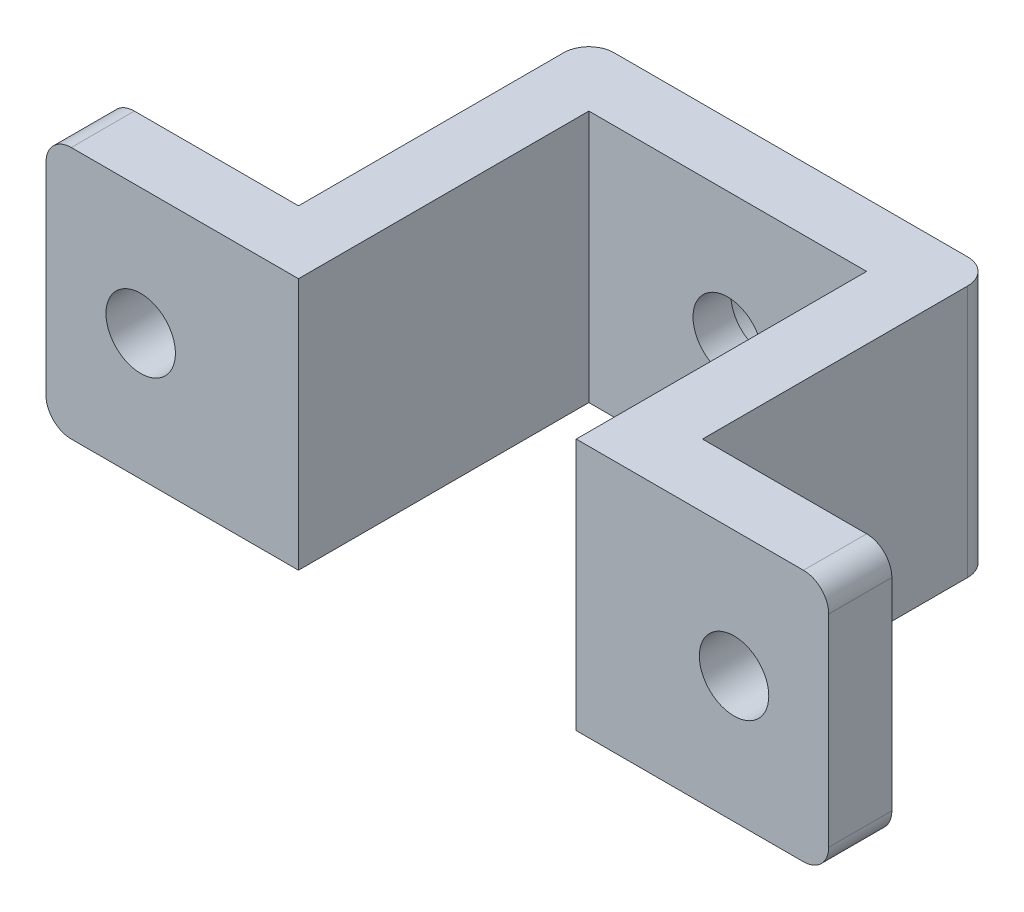
ISO-10303-21;
HEADER;
FILE_DESCRIPTION(('STEP AP214'),'2;1');
FILE_NAME('part.step','',(''),(''),'','','');
FILE_SCHEMA(('AUTOMOTIVE_DESIGN { 1 0 10303 214 1 1 1 1 }'));
ENDSEC;
DATA;
#1=APPLICATION_CONTEXT('core data for automotive mechanical design processes');
#2=APPLICATION_PROTOCOL_DEFINITION('international standard','automotive_design',2000,#1);
#3=PRODUCT_CONTEXT('',#1,'mechanical');
#4=PRODUCT('Part','Part','',(#3));
#5=PRODUCT_RELATED_PRODUCT_CATEGORY('part','',(#4));
#6=PRODUCT_DEFINITION_FORMATION('','',#4);
#7=PRODUCT_DEFINITION_CONTEXT('part definition',#1,'design');
#8=PRODUCT_DEFINITION('design','',#6,#7);
#9=PRODUCT_DEFINITION_SHAPE('','',#8);
#10=(LENGTH_UNIT() NAMED_UNIT(*) SI_UNIT(.MILLI.,.METRE.));
#11=(NAMED_UNIT(*) PLANE_ANGLE_UNIT() SI_UNIT($,.RADIAN.));
#12=(NAMED_UNIT(*) SI_UNIT($,.STERADIAN.) SOLID_ANGLE_UNIT());
#13=UNCERTAINTY_MEASURE_WITH_UNIT(LENGTH_MEASURE(1.E-05),#10,'distance_accuracy_value','');
#14=(GEOMETRIC_REPRESENTATION_CONTEXT(3) GLOBAL_UNCERTAINTY_ASSIGNED_CONTEXT((#13)) GLOBAL_UNIT_ASSIGNED_CONTEXT((#10,
#11,#12)) REPRESENTATION_CONTEXT('',''));
#15=CARTESIAN_POINT('',(0.,0.,0.));
#16=DIRECTION('',(0.,0.,1.));
#17=DIRECTION('',(1.,0.,0.));
#18=AXIS2_PLACEMENT_3D('',#15,#16,#17);
#19=CARTESIAN_POINT('',(3.94202898550725,10.,21.7777777777778));
#20=DIRECTION('',(0.,0.,-1.));
#21=DIRECTION('',(-1.,0.,0.));
#22=AXIS2_PLACEMENT_3D('',#19,#20,#21);
#23=CYLINDRICAL_SURFACE('',#22,2.75);
#24=CARTESIAN_POINT('',(3.94202898550725,10.,-1.22222222222222));
#25=DIRECTION('',(0.,0.,-1.));
#26=DIRECTION('',(-1.,0.,0.));
#27=AXIS2_PLACEMENT_3D('',#24,#25,#26);
#28=CIRCLE('',#27,2.75);
#29=CARTESIAN_POINT('',(1.19202898550725,10.,-1.22222222222222));
#30=VERTEX_POINT('',#29);
#31=EDGE_CURVE('E229',#30,#30,#28,.T.);
#32=ORIENTED_EDGE('',*,*,#31,.F.);
#33=EDGE_LOOP('',(#32));
#34=FACE_BOUND('',#33,.T.);
#35=CARTESIAN_POINT('',(3.94202898550725,10.,-4.22222222222222));
#36=DIRECTION('',(0.,0.,-1.));
#37=DIRECTION('',(-1.,0.,0.));
#38=AXIS2_PLACEMENT_3D('',#35,#36,#37);
#39=CIRCLE('',#38,2.75);
#40=CARTESIAN_POINT('',(1.19202898550725,10.,-4.22222222222222));
#41=VERTEX_POINT('',#40);
#42=EDGE_CURVE('E63',#41,#41,#39,.F.);
#43=ORIENTED_EDGE('',*,*,#42,.F.);
#44=EDGE_LOOP('',(#43));
#45=FACE_BOUND('',#44,.T.);
#46=ADVANCED_FACE('F59',(#34,#45),#23,.F.);
#47=CARTESIAN_POINT('',(-12.0579710144928,20.,-6.22222222222222));
#48=DIRECTION('',(1.,0.,0.));
#49=DIRECTION('',(0.,0.,-1.));
#50=AXIS2_PLACEMENT_3D('',#47,#48,#49);
#51=PLANE('',#50);
#52=DIRECTION('',(0.,0.,1.));
#53=VECTOR('',#52,1.);
#54=CARTESIAN_POINT('',(-12.0579710144928,20.,-6.22222222222222));
#55=LINE('',#54,#53);
#56=CARTESIAN_POINT('',(-12.0579710144928,20.,-4.22222222222222));
#57=VERTEX_POINT('',#56);
#58=CARTESIAN_POINT('',(-12.0579710144928,20.,16.7777777777778));
#59=VERTEX_POINT('',#58);
#60=EDGE_CURVE('E246',#57,#59,#55,.T.);
#61=ORIENTED_EDGE('',*,*,#60,.F.);
#62=DIRECTION('',(0.,-1.,0.));
#63=VECTOR('',#62,1.);
#64=CARTESIAN_POINT('',(-12.0579710144928,20.,-4.22222222222222));
#65=LINE('',#64,#63);
#66=CARTESIAN_POINT('',(-12.0579710144928,0.,-4.22222222222222));
#67=VERTEX_POINT('',#66);
#68=EDGE_CURVE('E12',#57,#67,#65,.T.);
#69=ORIENTED_EDGE('',*,*,#68,.T.);
#70=DIRECTION('',(0.,0.,1.));
#71=VECTOR('',#70,1.);
#72=CARTESIAN_POINT('',(-12.0579710144928,0.,-6.22222222222222));
#73=LINE('',#72,#71);
#74=CARTESIAN_POINT('',(-12.0579710144928,0.,16.7777777777778));
#75=VERTEX_POINT('',#74);
#76=EDGE_CURVE('E225',#67,#75,#73,.T.);
#77=ORIENTED_EDGE('',*,*,#76,.T.);
#78=DIRECTION('',(0.,-1.,0.));
#79=VECTOR('',#78,1.);
#80=CARTESIAN_POINT('',(-12.0579710144928,0.,16.7777777777778));
#81=LINE('',#80,#79);
#82=EDGE_CURVE('E325',#59,#75,#81,.T.);
#83=ORIENTED_EDGE('',*,*,#82,.F.);
#84=EDGE_LOOP('',(#61,#69,#77,#83));
#85=FACE_BOUND('',#84,.T.);
#86=ADVANCED_FACE('F389',(#85),#51,.F.);
#87=CARTESIAN_POINT('',(-12.0579710144928,20.,21.7777777777778));
#88=DIRECTION('',(0.,0.,-1.));
#89=DIRECTION('',(-1.,0.,0.));
#90=AXIS2_PLACEMENT_3D('',#87,#88,#89);
#91=PLANE('',#90);
#92=CARTESIAN_POINT('',(-19.5579710144928,10.,21.7777777777778));
#93=DIRECTION('',(0.,0.,-1.));
#94=DIRECTION('',(-1.,0.,0.));
#95=AXIS2_PLACEMENT_3D('',#92,#93,#94);
#96=CIRCLE('',#95,2.75);
#97=CARTESIAN_POINT('',(-22.3079710144928,10.,21.7777777777778));
#98=VERTEX_POINT('',#97);
#99=EDGE_CURVE('E328',#98,#98,#96,.T.);
#100=ORIENTED_EDGE('',*,*,#99,.T.);
#101=EDGE_LOOP('',(#100));
#102=FACE_BOUND('',#101,.T.);
#103=DIRECTION('',(0.,1.,0.));
#104=VECTOR('',#103,1.);
#105=CARTESIAN_POINT('',(-27.0579710144928,20.,21.7777777777778));
#106=LINE('',#105,#104);
#107=CARTESIAN_POINT('',(-27.0579710144928,2.,21.7777777777778));
#108=VERTEX_POINT('',#107);
#109=CARTESIAN_POINT('',(-27.0579710144928,18.,21.7777777777778));
#110=VERTEX_POINT('',#109);
#111=EDGE_CURVE('E319',#108,#110,#106,.T.);
#112=ORIENTED_EDGE('',*,*,#111,.F.);
#113=CARTESIAN_POINT('',(-25.0579710144928,2.,21.7777777777778));
#114=DIRECTION('',(0.,0.,-1.));
#115=DIRECTION('',(-1.,0.,0.));
#116=AXIS2_PLACEMENT_3D('',#113,#114,#115);
#117=CIRCLE('',#116,2.);
#118=CARTESIAN_POINT('',(-25.0579710144928,0.,21.7777777777778));
#119=VERTEX_POINT('',#118);
#120=EDGE_CURVE('E299',#108,#119,#117,.F.);
#121=ORIENTED_EDGE('',*,*,#120,.T.);
#122=DIRECTION('',(1.,0.,0.));
#123=VECTOR('',#122,1.);
#124=CARTESIAN_POINT('',(-12.0579710144928,0.,21.7777777777778));
#125=LINE('',#124,#123);
#126=CARTESIAN_POINT('',(-7.05797101449275,0.,21.7777777777778));
#127=VERTEX_POINT('',#126);
#128=EDGE_CURVE('E228',#119,#127,#125,.T.);
#129=ORIENTED_EDGE('',*,*,#128,.T.);
#130=DIRECTION('',(0.,-1.,0.));
#131=VECTOR('',#130,1.);
#132=CARTESIAN_POINT('',(-7.05797101449275,20.,21.7777777777778));
#133=LINE('',#132,#131);
#134=CARTESIAN_POINT('',(-7.05797101449275,20.,21.7777777777778));
#135=VERTEX_POINT('',#134);
#136=EDGE_CURVE('E255',#135,#127,#133,.T.);
#137=ORIENTED_EDGE('',*,*,#136,.F.);
#138=DIRECTION('',(1.,0.,0.));
#139=VECTOR('',#138,1.);
#140=CARTESIAN_POINT('',(-12.0579710144928,20.,21.7777777777778));
#141=LINE('',#140,#139);
#142=CARTESIAN_POINT('',(-25.0579710144928,20.,21.7777777777778));
#143=VERTEX_POINT('',#142);
#144=EDGE_CURVE('E321',#143,#135,#141,.T.);
#145=ORIENTED_EDGE('',*,*,#144,.F.);
#146=CARTESIAN_POINT('',(-25.0579710144928,18.,21.7777777777778));
#147=DIRECTION('',(0.,0.,-1.));
#148=DIRECTION('',(-1.,0.,0.));
#149=AXIS2_PLACEMENT_3D('',#146,#147,#148);
#150=CIRCLE('',#149,2.);
#151=EDGE_CURVE('E297',#143,#110,#150,.F.);
#152=ORIENTED_EDGE('',*,*,#151,.T.);
#153=EDGE_LOOP('',(#112,#121,#129,#137,#145,#152));
#154=FACE_BOUND('',#153,.T.);
#155=ADVANCED_FACE('F318',(#102,#154),#91,.F.);
#156=CARTESIAN_POINT('',(-7.05797101449275,20.,-1.22222222222222));
#157=DIRECTION('',(-1.,0.,0.));
#158=DIRECTION('',(0.,0.,1.));
#159=AXIS2_PLACEMENT_3D('',#156,#157,#158);
#160=PLANE('',#159);
#161=DIRECTION('',(0.,0.,-1.));
#162=VECTOR('',#161,1.);
#163=CARTESIAN_POINT('',(-7.05797101449275,0.,-1.22222222222222));
#164=LINE('',#163,#162);
#165=CARTESIAN_POINT('',(-7.05797101449275,0.,-1.22222222222222));
#166=VERTEX_POINT('',#165);
#167=EDGE_CURVE('E231',#127,#166,#164,.T.);
#168=ORIENTED_EDGE('',*,*,#167,.T.);
#169=DIRECTION('',(0.,-1.,0.));
#170=VECTOR('',#169,1.);
#171=CARTESIAN_POINT('',(-7.05797101449275,20.,-1.22222222222222));
#172=LINE('',#171,#170);
#173=CARTESIAN_POINT('',(-7.05797101449275,20.,-1.22222222222222));
#174=VERTEX_POINT('',#173);
#175=EDGE_CURVE('E252',#174,#166,#172,.T.);
#176=ORIENTED_EDGE('',*,*,#175,.F.);
#177=DIRECTION('',(0.,0.,-1.));
#178=VECTOR('',#177,1.);
#179=CARTESIAN_POINT('',(-7.05797101449275,20.,16.7777777777778));
#180=LINE('',#179,#178);
#181=EDGE_CURVE('E339',#135,#174,#180,.T.);
#182=ORIENTED_EDGE('',*,*,#181,.F.);
#183=ORIENTED_EDGE('',*,*,#136,.T.);
#184=EDGE_LOOP('',(#168,#176,#182,#183));
#185=FACE_BOUND('',#184,.T.);
#186=ADVANCED_FACE('F415',(#185),#160,.F.);
#187=CARTESIAN_POINT('',(-7.05797101449275,20.,-1.22222222222222));
#188=DIRECTION('',(0.,0.,-1.));
#189=DIRECTION('',(-1.,0.,0.));
#190=AXIS2_PLACEMENT_3D('',#187,#188,#189);
#191=PLANE('',#190);
#192=ORIENTED_EDGE('',*,*,#31,.T.);
#193=EDGE_LOOP('',(#192));
#194=FACE_BOUND('',#193,.T.);
#195=DIRECTION('',(1.,0.,0.));
#196=VECTOR('',#195,1.);
#197=CARTESIAN_POINT('',(-7.05797101449275,0.,-1.22222222222222));
#198=LINE('',#197,#196);
#199=CARTESIAN_POINT('',(14.9420289855072,0.,-1.22222222222222));
#200=VERTEX_POINT('',#199);
#201=EDGE_CURVE('E233',#166,#200,#198,.T.);
#202=ORIENTED_EDGE('',*,*,#201,.T.);
#203=DIRECTION('',(0.,-1.,0.));
#204=VECTOR('',#203,1.);
#205=CARTESIAN_POINT('',(14.9420289855072,20.,-1.22222222222222));
#206=LINE('',#205,#204);
#207=CARTESIAN_POINT('',(14.9420289855072,20.,-1.22222222222222));
#208=VERTEX_POINT('',#207);
#209=EDGE_CURVE('E249',#208,#200,#206,.T.);
#210=ORIENTED_EDGE('',*,*,#209,.F.);
#211=DIRECTION('',(1.,0.,0.));
#212=VECTOR('',#211,1.);
#213=CARTESIAN_POINT('',(-7.05797101449275,20.,-1.22222222222222));
#214=LINE('',#213,#212);
#215=EDGE_CURVE('E341',#174,#208,#214,.T.);
#216=ORIENTED_EDGE('',*,*,#215,.F.);
#217=ORIENTED_EDGE('',*,*,#175,.T.);
#218=EDGE_LOOP('',(#202,#210,#216,#217));
#219=FACE_BOUND('',#218,.T.);
#220=ADVANCED_FACE('F412',(#194,#219),#191,.F.);
#221=CARTESIAN_POINT('',(14.9420289855072,20.,16.7777777777778));
#222=DIRECTION('',(1.,0.,0.));
#223=DIRECTION('',(0.,0.,-1.));
#224=AXIS2_PLACEMENT_3D('',#221,#222,#223);
#225=PLANE('',#224);
#226=DIRECTION('',(0.,0.,1.));
#227=VECTOR('',#226,1.);
#228=CARTESIAN_POINT('',(14.9420289855072,0.,16.7777777777778));
#229=LINE('',#228,#227);
#230=CARTESIAN_POINT('',(14.9420289855072,0.,21.7777777777778));
#231=VERTEX_POINT('',#230);
#232=EDGE_CURVE('E236',#200,#231,#229,.T.);
#233=ORIENTED_EDGE('',*,*,#232,.T.);
#234=DIRECTION('',(0.,-1.,0.));
#235=VECTOR('',#234,1.);
#236=CARTESIAN_POINT('',(14.9420289855072,20.,21.7777777777778));
#237=LINE('',#236,#235);
#238=CARTESIAN_POINT('',(14.9420289855072,20.,21.7777777777778));
#239=VERTEX_POINT('',#238);
#240=EDGE_CURVE('E219',#239,#231,#237,.T.);
#241=ORIENTED_EDGE('',*,*,#240,.F.);
#242=DIRECTION('',(0.,0.,1.));
#243=VECTOR('',#242,1.);
#244=CARTESIAN_POINT('',(14.9420289855072,20.,-1.22222222222222));
#245=LINE('',#244,#243);
#246=EDGE_CURVE('E221',#208,#239,#245,.T.);
#247=ORIENTED_EDGE('',*,*,#246,.F.);
#248=ORIENTED_EDGE('',*,*,#209,.T.);
#249=EDGE_LOOP('',(#233,#241,#247,#248));
#250=FACE_BOUND('',#249,.T.);
#251=ADVANCED_FACE('F348',(#250),#225,.F.);
#252=CARTESIAN_POINT('',(14.9420289855072,20.,21.7777777777778));
#253=DIRECTION('',(0.,0.,-1.));
#254=DIRECTION('',(-1.,0.,0.));
#255=AXIS2_PLACEMENT_3D('',#252,#253,#254);
#256=PLANE('',#255);
#257=CARTESIAN_POINT('',(27.4420289855073,10.,21.7777777777778));
#258=DIRECTION('',(0.,0.,1.));
#259=DIRECTION('',(1.,0.,0.));
#260=AXIS2_PLACEMENT_3D('',#257,#258,#259);
#261=CIRCLE('',#260,2.75);
#262=CARTESIAN_POINT('',(30.1920289855072,10.,21.7777777777778));
#263=VERTEX_POINT('',#262);
#264=EDGE_CURVE('E210',#263,#263,#261,.T.);
#265=ORIENTED_EDGE('',*,*,#264,.F.);
#266=EDGE_LOOP('',(#265));
#267=FACE_BOUND('',#266,.T.);
#268=DIRECTION('',(1.,0.,0.));
#269=VECTOR('',#268,1.);
#270=CARTESIAN_POINT('',(14.9420289855072,0.,21.7777777777778));
#271=LINE('',#270,#269);
#272=CARTESIAN_POINT('',(32.9420289855072,0.,21.7777777777778));
#273=VERTEX_POINT('',#272);
#274=EDGE_CURVE('E238',#231,#273,#271,.T.);
#275=ORIENTED_EDGE('',*,*,#274,.T.);
#276=CARTESIAN_POINT('',(32.9420289855072,2.,21.7777777777778));
#277=DIRECTION('',(0.,0.,-1.));
#278=DIRECTION('',(-1.,0.,0.));
#279=AXIS2_PLACEMENT_3D('',#276,#277,#278);
#280=CIRCLE('',#279,2.);
#281=CARTESIAN_POINT('',(34.9420289855072,2.,21.7777777777778));
#282=VERTEX_POINT('',#281);
#283=EDGE_CURVE('E269',#273,#282,#280,.F.);
#284=ORIENTED_EDGE('',*,*,#283,.T.);
#285=DIRECTION('',(0.,1.,0.));
#286=VECTOR('',#285,1.);
#287=CARTESIAN_POINT('',(34.9420289855072,20.,21.7777777777778));
#288=LINE('',#287,#286);
#289=CARTESIAN_POINT('',(34.9420289855072,18.,21.7777777777778));
#290=VERTEX_POINT('',#289);
#291=EDGE_CURVE('E199',#282,#290,#288,.T.);
#292=ORIENTED_EDGE('',*,*,#291,.T.);
#293=CARTESIAN_POINT('',(32.9420289855072,18.,21.7777777777778));
#294=DIRECTION('',(0.,0.,-1.));
#295=DIRECTION('',(-1.,0.,0.));
#296=AXIS2_PLACEMENT_3D('',#293,#294,#295);
#297=CIRCLE('',#296,2.);
#298=CARTESIAN_POINT('',(32.9420289855072,20.,21.7777777777778));
#299=VERTEX_POINT('',#298);
#300=EDGE_CURVE('E267',#290,#299,#297,.F.);
#301=ORIENTED_EDGE('',*,*,#300,.T.);
#302=DIRECTION('',(1.,0.,0.));
#303=VECTOR('',#302,1.);
#304=CARTESIAN_POINT('',(14.9420289855072,20.,21.7777777777778));
#305=LINE('',#304,#303);
#306=EDGE_CURVE('E216',#239,#299,#305,.T.);
#307=ORIENTED_EDGE('',*,*,#306,.F.);
#308=ORIENTED_EDGE('',*,*,#240,.T.);
#309=EDGE_LOOP('',(#275,#284,#292,#301,#307,#308));
#310=FACE_BOUND('',#309,.T.);
#311=ADVANCED_FACE('F351',(#267,#310),#256,.F.);
#312=CARTESIAN_POINT('',(19.9420289855072,20.,-6.22222222222222));
#313=DIRECTION('',(-1.,0.,0.));
#314=DIRECTION('',(0.,0.,1.));
#315=AXIS2_PLACEMENT_3D('',#312,#313,#314);
#316=PLANE('',#315);
#317=DIRECTION('',(0.,0.,-1.));
#318=VECTOR('',#317,1.);
#319=CARTESIAN_POINT('',(19.9420289855072,0.,-6.22222222222222));
#320=LINE('',#319,#318);
#321=CARTESIAN_POINT('',(19.9420289855072,0.,16.7777777777778));
#322=VERTEX_POINT('',#321);
#323=CARTESIAN_POINT('',(19.9420289855072,0.,-4.22222222222222));
#324=VERTEX_POINT('',#323);
#325=EDGE_CURVE('E241',#322,#324,#320,.T.);
#326=ORIENTED_EDGE('',*,*,#325,.T.);
#327=DIRECTION('',(0.,-1.,0.));
#328=VECTOR('',#327,1.);
#329=CARTESIAN_POINT('',(19.9420289855072,20.,-4.22222222222222));
#330=LINE('',#329,#328);
#331=CARTESIAN_POINT('',(19.9420289855072,20.,-4.22222222222222));
#332=VERTEX_POINT('',#331);
#333=EDGE_CURVE('E214',#324,#332,#330,.F.);
#334=ORIENTED_EDGE('',*,*,#333,.T.);
#335=DIRECTION('',(0.,0.,-1.));
#336=VECTOR('',#335,1.);
#337=CARTESIAN_POINT('',(19.9420289855072,20.,-6.22222222222222));
#338=LINE('',#337,#336);
#339=CARTESIAN_POINT('',(19.9420289855073,20.,16.7777777777778));
#340=VERTEX_POINT('',#339);
#341=EDGE_CURVE('E193',#340,#332,#338,.T.);
#342=ORIENTED_EDGE('',*,*,#341,.F.);
#343=DIRECTION('',(0.,-1.,0.));
#344=VECTOR('',#343,1.);
#345=CARTESIAN_POINT('',(19.9420289855073,0.,16.7777777777778));
#346=LINE('',#345,#344);
#347=EDGE_CURVE('E202',#340,#322,#346,.T.);
#348=ORIENTED_EDGE('',*,*,#347,.T.);
#349=EDGE_LOOP('',(#326,#334,#342,#348));
#350=FACE_BOUND('',#349,.T.);
#351=ADVANCED_FACE('F212',(#350),#316,.F.);
#352=CARTESIAN_POINT('',(-12.0579710144928,20.,-6.22222222222222));
#353=DIRECTION('',(0.,0.,1.));
#354=DIRECTION('',(1.,0.,0.));
#355=AXIS2_PLACEMENT_3D('',#352,#353,#354);
#356=PLANE('',#355);
#357=CARTESIAN_POINT('',(3.94202898551479,9.99999999984602,-6.22222222222222));
#358=DIRECTION('',(0.,0.,-1.));
#359=DIRECTION('',(-1.,0.,0.));
#360=AXIS2_PLACEMENT_3D('',#357,#358,#359);
#361=CIRCLE('',#360,4.);
#362=CARTESIAN_POINT('',(-0.0579710144852051,9.99999999984602,-6.22222222222222));
#363=VERTEX_POINT('',#362);
#364=EDGE_CURVE('E653',#363,#363,#361,.T.);
#365=ORIENTED_EDGE('',*,*,#364,.F.);
#366=EDGE_LOOP('',(#365));
#367=FACE_BOUND('',#366,.T.);
#368=DIRECTION('',(-1.,0.,0.));
#369=VECTOR('',#368,1.);
#370=CARTESIAN_POINT('',(-12.0579710144928,20.,-6.22222222222222));
#371=LINE('',#370,#369);
#372=CARTESIAN_POINT('',(17.9420289855072,20.,-6.22222222222222));
#373=VERTEX_POINT('',#372);
#374=CARTESIAN_POINT('',(-10.0579710144928,20.,-6.22222222222222));
#375=VERTEX_POINT('',#374);
#376=EDGE_CURVE('E215',#373,#375,#371,.T.);
#377=ORIENTED_EDGE('',*,*,#376,.F.);
#378=DIRECTION('',(0.,-1.,0.));
#379=VECTOR('',#378,1.);
#380=CARTESIAN_POINT('',(17.9420289855072,20.,-6.22222222222222));
#381=LINE('',#380,#379);
#382=CARTESIAN_POINT('',(17.9420289855072,0.,-6.22222222222222));
#383=VERTEX_POINT('',#382);
#384=EDGE_CURVE('E288',#373,#383,#381,.T.);
#385=ORIENTED_EDGE('',*,*,#384,.T.);
#386=DIRECTION('',(-1.,0.,0.));
#387=VECTOR('',#386,1.);
#388=CARTESIAN_POINT('',(-12.0579710144928,0.,-6.22222222222222));
#389=LINE('',#388,#387);
#390=CARTESIAN_POINT('',(-10.0579710144928,0.,-6.22222222222222));
#391=VERTEX_POINT('',#390);
#392=EDGE_CURVE('E243',#383,#391,#389,.T.);
#393=ORIENTED_EDGE('',*,*,#392,.T.);
#394=DIRECTION('',(0.,-1.,0.));
#395=VECTOR('',#394,1.);
#396=CARTESIAN_POINT('',(-10.0579710144928,20.,-6.22222222222222));
#397=LINE('',#396,#395);
#398=EDGE_CURVE('E286',#391,#375,#397,.F.);
#399=ORIENTED_EDGE('',*,*,#398,.T.);
#400=EDGE_LOOP('',(#377,#385,#393,#399));
#401=FACE_BOUND('',#400,.T.);
#402=ADVANCED_FACE('F400',(#367,#401),#356,.F.);
#403=CARTESIAN_POINT('',(0.,20.,0.));
#404=DIRECTION('',(0.,1.,0.));
#405=DIRECTION('',(0.,0.,1.));
#406=AXIS2_PLACEMENT_3D('',#403,#404,#405);
#407=PLANE('',#406);
#408=ORIENTED_EDGE('',*,*,#306,.T.);
#409=DIRECTION('',(0.,0.,-1.));
#410=VECTOR('',#409,1.);
#411=CARTESIAN_POINT('',(32.9420289855072,20.,16.7777777777778));
#412=LINE('',#411,#410);
#413=CARTESIAN_POINT('',(32.9420289855072,20.,16.7777777777778));
#414=VERTEX_POINT('',#413);
#415=EDGE_CURVE('E196',#299,#414,#412,.T.);
#416=ORIENTED_EDGE('',*,*,#415,.T.);
#417=DIRECTION('',(-1.,0.,0.));
#418=VECTOR('',#417,1.);
#419=CARTESIAN_POINT('',(34.9420289855072,20.,16.7777777777778));
#420=LINE('',#419,#418);
#421=EDGE_CURVE('E188',#414,#340,#420,.T.);
#422=ORIENTED_EDGE('',*,*,#421,.T.);
#423=ORIENTED_EDGE('',*,*,#341,.T.);
#424=CARTESIAN_POINT('',(17.9420289855072,20.,-4.22222222222222));
#425=DIRECTION('',(0.,1.,0.));
#426=DIRECTION('',(0.,0.,1.));
#427=AXIS2_PLACEMENT_3D('',#424,#425,#426);
#428=CIRCLE('',#427,2.);
#429=EDGE_CURVE('E283',#332,#373,#428,.T.);
#430=ORIENTED_EDGE('',*,*,#429,.T.);
#431=ORIENTED_EDGE('',*,*,#376,.T.);
#432=CARTESIAN_POINT('',(-10.0579710144928,20.,-4.22222222222222));
#433=DIRECTION('',(0.,1.,0.));
#434=DIRECTION('',(0.,0.,1.));
#435=AXIS2_PLACEMENT_3D('',#432,#433,#434);
#436=CIRCLE('',#435,2.);
#437=EDGE_CURVE('E279',#375,#57,#436,.T.);
#438=ORIENTED_EDGE('',*,*,#437,.T.);
#439=ORIENTED_EDGE('',*,*,#60,.T.);
#440=DIRECTION('',(1.,0.,0.));
#441=VECTOR('',#440,1.);
#442=CARTESIAN_POINT('',(-27.0579710144928,20.,16.7777777777778));
#443=LINE('',#442,#441);
#444=CARTESIAN_POINT('',(-25.0579710144928,20.,16.7777777777778));
#445=VERTEX_POINT('',#444);
#446=EDGE_CURVE('E305',#445,#59,#443,.T.);
#447=ORIENTED_EDGE('',*,*,#446,.F.);
#448=DIRECTION('',(0.,0.,-1.));
#449=VECTOR('',#448,1.);
#450=CARTESIAN_POINT('',(-25.0579710144928,20.,21.7777777777778));
#451=LINE('',#450,#449);
#452=EDGE_CURVE('E281',#445,#143,#451,.F.);
#453=ORIENTED_EDGE('',*,*,#452,.T.);
#454=ORIENTED_EDGE('',*,*,#144,.T.);
#455=ORIENTED_EDGE('',*,*,#181,.T.);
#456=ORIENTED_EDGE('',*,*,#215,.T.);
#457=ORIENTED_EDGE('',*,*,#246,.T.);
#458=EDGE_LOOP('',(#408,#416,#422,#423,#430,#431,#438,#439,#447,#453,#454,#455,#456,#457));
#459=FACE_BOUND('',#458,.T.);
#460=ADVANCED_FACE('F191',(#459),#407,.T.);
#461=CARTESIAN_POINT('',(0.,0.,0.));
#462=DIRECTION('',(0.,1.,0.));
#463=DIRECTION('',(0.,0.,1.));
#464=AXIS2_PLACEMENT_3D('',#461,#462,#463);
#465=PLANE('',#464);
#466=DIRECTION('',(-1.,0.,0.));
#467=VECTOR('',#466,1.);
#468=CARTESIAN_POINT('',(34.9420289855072,0.,16.7777777777778));
#469=LINE('',#468,#467);
#470=CARTESIAN_POINT('',(32.9420289855072,0.,16.7777777777778));
#471=VERTEX_POINT('',#470);
#472=EDGE_CURVE('E198',#471,#322,#469,.T.);
#473=ORIENTED_EDGE('',*,*,#472,.F.);
#474=DIRECTION('',(0.,0.,1.));
#475=VECTOR('',#474,1.);
#476=CARTESIAN_POINT('',(32.9420289855072,0.,0.));
#477=LINE('',#476,#475);
#478=EDGE_CURVE('E264',#471,#273,#477,.T.);
#479=ORIENTED_EDGE('',*,*,#478,.T.);
#480=ORIENTED_EDGE('',*,*,#274,.F.);
#481=ORIENTED_EDGE('',*,*,#232,.F.);
#482=ORIENTED_EDGE('',*,*,#201,.F.);
#483=ORIENTED_EDGE('',*,*,#167,.F.);
#484=ORIENTED_EDGE('',*,*,#128,.F.);
#485=DIRECTION('',(0.,0.,1.));
#486=VECTOR('',#485,1.);
#487=CARTESIAN_POINT('',(-25.0579710144928,0.,0.));
#488=LINE('',#487,#486);
#489=CARTESIAN_POINT('',(-25.0579710144928,0.,16.7777777777778));
#490=VERTEX_POINT('',#489);
#491=EDGE_CURVE('E260',#119,#490,#488,.F.);
#492=ORIENTED_EDGE('',*,*,#491,.T.);
#493=DIRECTION('',(1.,0.,0.));
#494=VECTOR('',#493,1.);
#495=CARTESIAN_POINT('',(-27.0579710144928,0.,16.7777777777778));
#496=LINE('',#495,#494);
#497=EDGE_CURVE('E311',#490,#75,#496,.T.);
#498=ORIENTED_EDGE('',*,*,#497,.T.);
#499=ORIENTED_EDGE('',*,*,#76,.F.);
#500=CARTESIAN_POINT('',(-10.0579710144928,0.,-4.22222222222222));
#501=DIRECTION('',(0.,1.,0.));
#502=DIRECTION('',(0.,0.,1.));
#503=AXIS2_PLACEMENT_3D('',#500,#501,#502);
#504=CIRCLE('',#503,2.);
#505=EDGE_CURVE('E258',#67,#391,#504,.F.);
#506=ORIENTED_EDGE('',*,*,#505,.T.);
#507=ORIENTED_EDGE('',*,*,#392,.F.);
#508=CARTESIAN_POINT('',(17.9420289855072,0.,-4.22222222222222));
#509=DIRECTION('',(0.,1.,0.));
#510=DIRECTION('',(0.,0.,1.));
#511=AXIS2_PLACEMENT_3D('',#508,#509,#510);
#512=CIRCLE('',#511,2.);
#513=EDGE_CURVE('E262',#383,#324,#512,.F.);
#514=ORIENTED_EDGE('',*,*,#513,.T.);
#515=ORIENTED_EDGE('',*,*,#325,.F.);
#516=EDGE_LOOP('',(#473,#479,#480,#481,#482,#483,#484,#492,#498,#499,#506,#507,#514,#515));
#517=FACE_BOUND('',#516,.T.);
#518=ADVANCED_FACE('F378',(#517),#465,.F.);
#519=CARTESIAN_POINT('',(-27.0579710144928,0.,16.7777777777778));
#520=DIRECTION('',(0.,0.,1.));
#521=DIRECTION('',(1.,0.,0.));
#522=AXIS2_PLACEMENT_3D('',#519,#520,#521);
#523=PLANE('',#522);
#524=CARTESIAN_POINT('',(-19.5579710144928,10.,16.7777777777778));
#525=DIRECTION('',(0.,0.,-1.));
#526=DIRECTION('',(-1.,0.,0.));
#527=AXIS2_PLACEMENT_3D('',#524,#525,#526);
#528=CIRCLE('',#527,2.75);
#529=CARTESIAN_POINT('',(-22.3079710144928,10.,16.7777777777778));
#530=VERTEX_POINT('',#529);
#531=EDGE_CURVE('E331',#530,#530,#528,.T.);
#532=ORIENTED_EDGE('',*,*,#531,.F.);
#533=EDGE_LOOP('',(#532));
#534=FACE_BOUND('',#533,.T.);
#535=ORIENTED_EDGE('',*,*,#497,.F.);
#536=CARTESIAN_POINT('',(-25.0579710144928,2.,16.7777777777778));
#537=DIRECTION('',(0.,0.,1.));
#538=DIRECTION('',(1.,0.,0.));
#539=AXIS2_PLACEMENT_3D('',#536,#537,#538);
#540=CIRCLE('',#539,2.);
#541=CARTESIAN_POINT('',(-27.0579710144928,2.,16.7777777777778));
#542=VERTEX_POINT('',#541);
#543=EDGE_CURVE('E68',#490,#542,#540,.F.);
#544=ORIENTED_EDGE('',*,*,#543,.T.);
#545=DIRECTION('',(0.,-1.,0.));
#546=VECTOR('',#545,1.);
#547=CARTESIAN_POINT('',(-27.0579710144928,0.,16.7777777777778));
#548=LINE('',#547,#546);
#549=CARTESIAN_POINT('',(-27.0579710144928,18.,16.7777777777778));
#550=VERTEX_POINT('',#549);
#551=EDGE_CURVE('E307',#550,#542,#548,.T.);
#552=ORIENTED_EDGE('',*,*,#551,.F.);
#553=CARTESIAN_POINT('',(-25.0579710144928,18.,16.7777777777778));
#554=DIRECTION('',(0.,0.,1.));
#555=DIRECTION('',(1.,0.,0.));
#556=AXIS2_PLACEMENT_3D('',#553,#554,#555);
#557=CIRCLE('',#556,2.);
#558=EDGE_CURVE('E82',#550,#445,#557,.F.);
#559=ORIENTED_EDGE('',*,*,#558,.T.);
#560=ORIENTED_EDGE('',*,*,#446,.T.);
#561=ORIENTED_EDGE('',*,*,#82,.T.);
#562=EDGE_LOOP('',(#535,#544,#552,#559,#560,#561));
#563=FACE_BOUND('',#562,.T.);
#564=ADVANCED_FACE('F303',(#534,#563),#523,.F.);
#565=CARTESIAN_POINT('',(-27.0579710144928,0.,0.));
#566=DIRECTION('',(1.,0.,0.));
#567=DIRECTION('',(0.,0.,-1.));
#568=AXIS2_PLACEMENT_3D('',#565,#566,#567);
#569=PLANE('',#568);
#570=ORIENTED_EDGE('',*,*,#551,.T.);
#571=DIRECTION('',(0.,0.,1.));
#572=VECTOR('',#571,1.);
#573=CARTESIAN_POINT('',(-27.0579710144928,2.,0.));
#574=LINE('',#573,#572);
#575=EDGE_CURVE('E294',#542,#108,#574,.T.);
#576=ORIENTED_EDGE('',*,*,#575,.T.);
#577=ORIENTED_EDGE('',*,*,#111,.T.);
#578=DIRECTION('',(0.,0.,-1.));
#579=VECTOR('',#578,1.);
#580=CARTESIAN_POINT('',(-27.0579710144928,18.,16.7777777777778));
#581=LINE('',#580,#579);
#582=EDGE_CURVE('E292',#110,#550,#581,.T.);
#583=ORIENTED_EDGE('',*,*,#582,.T.);
#584=EDGE_LOOP('',(#570,#576,#577,#583));
#585=FACE_BOUND('',#584,.T.);
#586=ADVANCED_FACE('F323',(#585),#569,.F.);
#587=CARTESIAN_POINT('',(-19.5579710144928,10.,21.7777777777778));
#588=DIRECTION('',(0.,0.,-1.));
#589=DIRECTION('',(-1.,0.,0.));
#590=AXIS2_PLACEMENT_3D('',#587,#588,#589);
#591=CYLINDRICAL_SURFACE('',#590,2.75);
#592=ORIENTED_EDGE('',*,*,#99,.F.);
#593=EDGE_LOOP('',(#592));
#594=FACE_BOUND('',#593,.T.);
#595=ORIENTED_EDGE('',*,*,#531,.T.);
#596=EDGE_LOOP('',(#595));
#597=FACE_BOUND('',#596,.T.);
#598=ADVANCED_FACE('F375',(#594,#597),#591,.F.);
#599=CARTESIAN_POINT('',(34.9420289855072,0.,16.7777777777778));
#600=DIRECTION('',(0.,0.,-1.));
#601=DIRECTION('',(-1.,0.,0.));
#602=AXIS2_PLACEMENT_3D('',#599,#600,#601);
#603=PLANE('',#602);
#604=CARTESIAN_POINT('',(27.4420289855073,10.,16.7777777777778));
#605=DIRECTION('',(0.,0.,1.));
#606=DIRECTION('',(1.,0.,0.));
#607=AXIS2_PLACEMENT_3D('',#604,#605,#606);
#608=CIRCLE('',#607,2.75);
#609=CARTESIAN_POINT('',(30.1920289855072,10.,16.7777777777778));
#610=VERTEX_POINT('',#609);
#611=EDGE_CURVE('E366',#610,#610,#608,.T.);
#612=ORIENTED_EDGE('',*,*,#611,.T.);
#613=EDGE_LOOP('',(#612));
#614=FACE_BOUND('',#613,.T.);
#615=DIRECTION('',(0.,-1.,0.));
#616=VECTOR('',#615,1.);
#617=CARTESIAN_POINT('',(34.9420289855072,0.,16.7777777777778));
#618=LINE('',#617,#616);
#619=CARTESIAN_POINT('',(34.9420289855072,18.,16.7777777777778));
#620=VERTEX_POINT('',#619);
#621=CARTESIAN_POINT('',(34.9420289855072,2.,16.7777777777778));
#622=VERTEX_POINT('',#621);
#623=EDGE_CURVE('E209',#620,#622,#618,.T.);
#624=ORIENTED_EDGE('',*,*,#623,.T.);
#625=CARTESIAN_POINT('',(32.9420289855072,2.,16.7777777777778));
#626=DIRECTION('',(0.,0.,-1.));
#627=DIRECTION('',(-1.,0.,0.));
#628=AXIS2_PLACEMENT_3D('',#625,#626,#627);
#629=CIRCLE('',#628,2.);
#630=EDGE_CURVE('E277',#622,#471,#629,.T.);
#631=ORIENTED_EDGE('',*,*,#630,.T.);
#632=ORIENTED_EDGE('',*,*,#472,.T.);
#633=ORIENTED_EDGE('',*,*,#347,.F.);
#634=ORIENTED_EDGE('',*,*,#421,.F.);
#635=CARTESIAN_POINT('',(32.9420289855072,18.,16.7777777777778));
#636=DIRECTION('',(0.,0.,-1.));
#637=DIRECTION('',(-1.,0.,0.));
#638=AXIS2_PLACEMENT_3D('',#635,#636,#637);
#639=CIRCLE('',#638,2.);
#640=EDGE_CURVE('E275',#414,#620,#639,.T.);
#641=ORIENTED_EDGE('',*,*,#640,.T.);
#642=EDGE_LOOP('',(#624,#631,#632,#633,#634,#641));
#643=FACE_BOUND('',#642,.T.);
#644=ADVANCED_FACE('F204',(#614,#643),#603,.T.);
#645=CARTESIAN_POINT('',(34.9420289855072,0.,0.));
#646=DIRECTION('',(-1.,0.,0.));
#647=DIRECTION('',(0.,0.,-1.));
#648=AXIS2_PLACEMENT_3D('',#645,#646,#647);
#649=PLANE('',#648);
#650=ORIENTED_EDGE('',*,*,#291,.F.);
#651=DIRECTION('',(0.,0.,1.));
#652=VECTOR('',#651,1.);
#653=CARTESIAN_POINT('',(34.9420289855072,2.,0.));
#654=LINE('',#653,#652);
#655=EDGE_CURVE('E273',#282,#622,#654,.F.);
#656=ORIENTED_EDGE('',*,*,#655,.T.);
#657=ORIENTED_EDGE('',*,*,#623,.F.);
#658=DIRECTION('',(0.,0.,-1.));
#659=VECTOR('',#658,1.);
#660=CARTESIAN_POINT('',(34.9420289855072,18.,21.7777777777778));
#661=LINE('',#660,#659);
#662=EDGE_CURVE('E271',#620,#290,#661,.F.);
#663=ORIENTED_EDGE('',*,*,#662,.T.);
#664=EDGE_LOOP('',(#650,#656,#657,#663));
#665=FACE_BOUND('',#664,.T.);
#666=ADVANCED_FACE('F361',(#665),#649,.F.);
#667=CARTESIAN_POINT('',(27.4420289855073,10.,21.7777777777778));
#668=DIRECTION('',(0.,0.,-1.));
#669=DIRECTION('',(-1.,0.,0.));
#670=AXIS2_PLACEMENT_3D('',#667,#668,#669);
#671=CYLINDRICAL_SURFACE('',#670,2.75);
#672=ORIENTED_EDGE('',*,*,#264,.T.);
#673=EDGE_LOOP('',(#672));
#674=FACE_BOUND('',#673,.T.);
#675=ORIENTED_EDGE('',*,*,#611,.F.);
#676=EDGE_LOOP('',(#675));
#677=FACE_BOUND('',#676,.T.);
#678=ADVANCED_FACE('F425',(#674,#677),#671,.F.);
#679=CARTESIAN_POINT('',(32.9420289855072,2.,0.));
#680=DIRECTION('',(0.,0.,1.));
#681=DIRECTION('',(1.,0.,0.));
#682=AXIS2_PLACEMENT_3D('',#679,#680,#681);
#683=CYLINDRICAL_SURFACE('',#682,2.);
#684=ORIENTED_EDGE('',*,*,#630,.F.);
#685=ORIENTED_EDGE('',*,*,#655,.F.);
#686=ORIENTED_EDGE('',*,*,#283,.F.);
#687=ORIENTED_EDGE('',*,*,#478,.F.);
#688=EDGE_LOOP('',(#684,#685,#686,#687));
#689=FACE_BOUND('',#688,.T.);
#690=ADVANCED_FACE('F422',(#689),#683,.T.);
#691=CARTESIAN_POINT('',(32.9420289855072,18.,0.));
#692=DIRECTION('',(0.,0.,1.));
#693=DIRECTION('',(1.,0.,0.));
#694=AXIS2_PLACEMENT_3D('',#691,#692,#693);
#695=CYLINDRICAL_SURFACE('',#694,2.);
#696=ORIENTED_EDGE('',*,*,#300,.F.);
#697=ORIENTED_EDGE('',*,*,#662,.F.);
#698=ORIENTED_EDGE('',*,*,#640,.F.);
#699=ORIENTED_EDGE('',*,*,#415,.F.);
#700=EDGE_LOOP('',(#696,#697,#698,#699));
#701=FACE_BOUND('',#700,.T.);
#702=ADVANCED_FACE('F357',(#701),#695,.T.);
#703=CARTESIAN_POINT('',(17.9420289855072,20.,-4.22222222222222));
#704=DIRECTION('',(0.,-1.,0.));
#705=DIRECTION('',(0.,0.,-1.));
#706=AXIS2_PLACEMENT_3D('',#703,#704,#705);
#707=CYLINDRICAL_SURFACE('',#706,2.);
#708=ORIENTED_EDGE('',*,*,#429,.F.);
#709=ORIENTED_EDGE('',*,*,#333,.F.);
#710=ORIENTED_EDGE('',*,*,#513,.F.);
#711=ORIENTED_EDGE('',*,*,#384,.F.);
#712=EDGE_LOOP('',(#708,#709,#710,#711));
#713=FACE_BOUND('',#712,.T.);
#714=ADVANCED_FACE('F429',(#713),#707,.T.);
#715=CARTESIAN_POINT('',(-25.0579710144928,2.,0.));
#716=DIRECTION('',(0.,0.,1.));
#717=DIRECTION('',(1.,0.,0.));
#718=AXIS2_PLACEMENT_3D('',#715,#716,#717);
#719=CYLINDRICAL_SURFACE('',#718,2.);
#720=ORIENTED_EDGE('',*,*,#543,.F.);
#721=ORIENTED_EDGE('',*,*,#491,.F.);
#722=ORIENTED_EDGE('',*,*,#120,.F.);
#723=ORIENTED_EDGE('',*,*,#575,.F.);
#724=EDGE_LOOP('',(#720,#721,#722,#723));
#725=FACE_BOUND('',#724,.T.);
#726=ADVANCED_FACE('F432',(#725),#719,.T.);
#727=CARTESIAN_POINT('',(-25.0579710144928,18.,0.));
#728=DIRECTION('',(0.,0.,1.));
#729=DIRECTION('',(1.,0.,0.));
#730=AXIS2_PLACEMENT_3D('',#727,#728,#729);
#731=CYLINDRICAL_SURFACE('',#730,2.);
#732=ORIENTED_EDGE('',*,*,#151,.F.);
#733=ORIENTED_EDGE('',*,*,#452,.F.);
#734=ORIENTED_EDGE('',*,*,#558,.F.);
#735=ORIENTED_EDGE('',*,*,#582,.F.);
#736=EDGE_LOOP('',(#732,#733,#734,#735));
#737=FACE_BOUND('',#736,.T.);
#738=ADVANCED_FACE('F314',(#737),#731,.T.);
#739=CARTESIAN_POINT('',(-10.0579710144928,20.,-4.22222222222222));
#740=DIRECTION('',(0.,-1.,0.));
#741=DIRECTION('',(0.,0.,-1.));
#742=AXIS2_PLACEMENT_3D('',#739,#740,#741);
#743=CYLINDRICAL_SURFACE('',#742,2.);
#744=ORIENTED_EDGE('',*,*,#437,.F.);
#745=ORIENTED_EDGE('',*,*,#398,.F.);
#746=ORIENTED_EDGE('',*,*,#505,.F.);
#747=ORIENTED_EDGE('',*,*,#68,.F.);
#748=EDGE_LOOP('',(#744,#745,#746,#747));
#749=FACE_BOUND('',#748,.T.);
#750=ADVANCED_FACE('F61',(#749),#743,.T.);
#751=CARTESIAN_POINT('',(3.94202898551479,9.99999999984602,-4.22222222222222));
#752=DIRECTION('',(0.,0.,-1.));
#753=DIRECTION('',(-1.,0.,0.));
#754=AXIS2_PLACEMENT_3D('',#751,#752,#753);
#755=PLANE('',#754);
#756=CARTESIAN_POINT('',(3.94202898551479,9.99999999984602,-4.22222222222222));
#757=DIRECTION('',(0.,0.,-1.));
#758=DIRECTION('',(-1.,0.,0.));
#759=AXIS2_PLACEMENT_3D('',#756,#757,#758);
#760=CIRCLE('',#759,4.);
#761=CARTESIAN_POINT('',(-0.0579710144852051,9.99999999984602,-4.22222222222222));
#762=VERTEX_POINT('',#761);
#763=EDGE_CURVE('E651',#762,#762,#760,.T.);
#764=ORIENTED_EDGE('',*,*,#763,.T.);
#765=EDGE_LOOP('',(#764));
#766=FACE_BOUND('',#765,.T.);
#767=ORIENTED_EDGE('',*,*,#42,.T.);
#768=EDGE_LOOP('',(#767));
#769=FACE_BOUND('',#768,.T.);
#770=ADVANCED_FACE('F440',(#766,#769),#755,.T.);
#771=CARTESIAN_POINT('',(3.94202898551479,9.99999999984602,-4.22222222222222));
#772=DIRECTION('',(0.,0.,-1.));
#773=DIRECTION('',(-1.,0.,0.));
#774=AXIS2_PLACEMENT_3D('',#771,#772,#773);
#775=CYLINDRICAL_SURFACE('',#774,4.);
#776=ORIENTED_EDGE('',*,*,#763,.F.);
#777=EDGE_LOOP('',(#776));
#778=FACE_BOUND('',#777,.T.);
#779=ORIENTED_EDGE('',*,*,#364,.T.);
#780=EDGE_LOOP('',(#779));
#781=FACE_BOUND('',#780,.T.);
#782=ADVANCED_FACE('F445',(#778,#781),#775,.F.);
#783=CLOSED_SHELL('',(#46,#86,#155,#186,#220,#251,#311,#351,#402,#460,#518,#564,#586,#598,#644,
#666,#678,#690,#702,#714,#726,#738,#750,#770,#782));
#784=MANIFOLD_SOLID_BREP('B2',#783);
#785=ADVANCED_BREP_SHAPE_REPRESENTATION('',(#18,#784),#14);
#786=SHAPE_DEFINITION_REPRESENTATION(#9,#785);
ENDSEC;
END-ISO-10303-21;
